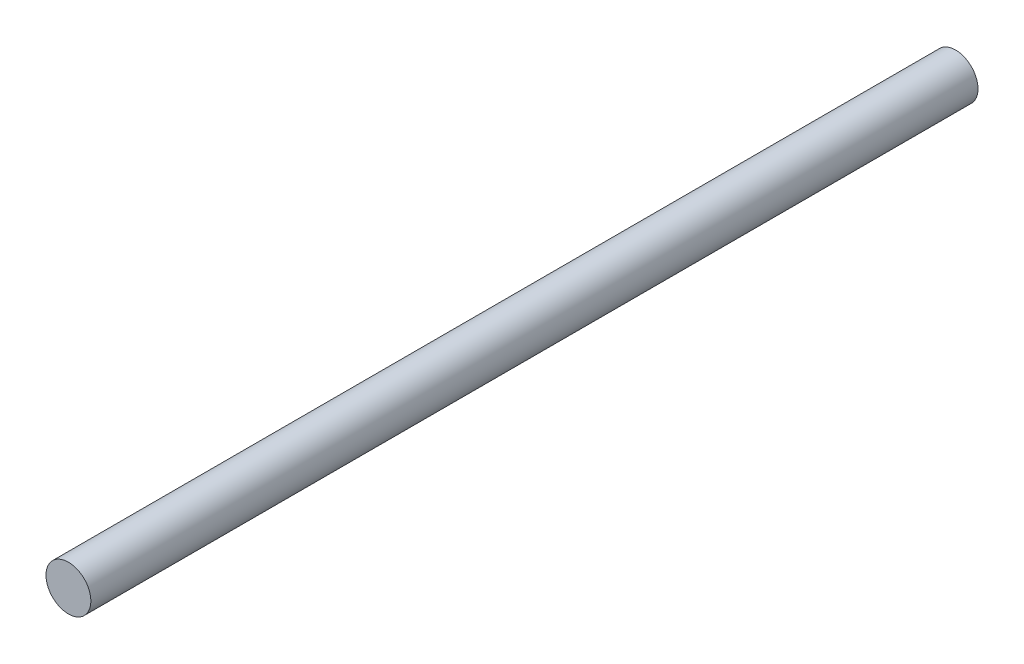
ISO-10303-21;
HEADER;
FILE_DESCRIPTION(('STEP AP214'),'2;1');
FILE_NAME('part.step','',(''),(''),'','','');
FILE_SCHEMA(('AUTOMOTIVE_DESIGN { 1 0 10303 214 1 1 1 1 }'));
ENDSEC;
DATA;
#1=APPLICATION_CONTEXT('core data for automotive mechanical design processes');
#2=APPLICATION_PROTOCOL_DEFINITION('international standard','automotive_design',2000,#1);
#3=PRODUCT_CONTEXT('',#1,'mechanical');
#4=PRODUCT('Part','Part','',(#3));
#5=PRODUCT_RELATED_PRODUCT_CATEGORY('part','',(#4));
#6=PRODUCT_DEFINITION_FORMATION('','',#4);
#7=PRODUCT_DEFINITION_CONTEXT('part definition',#1,'design');
#8=PRODUCT_DEFINITION('design','',#6,#7);
#9=PRODUCT_DEFINITION_SHAPE('','',#8);
#10=(LENGTH_UNIT() NAMED_UNIT(*) SI_UNIT(.MILLI.,.METRE.));
#11=(NAMED_UNIT(*) PLANE_ANGLE_UNIT() SI_UNIT($,.RADIAN.));
#12=(NAMED_UNIT(*) SI_UNIT($,.STERADIAN.) SOLID_ANGLE_UNIT());
#13=UNCERTAINTY_MEASURE_WITH_UNIT(LENGTH_MEASURE(1.E-05),#10,'distance_accuracy_value','');
#14=(GEOMETRIC_REPRESENTATION_CONTEXT(3) GLOBAL_UNCERTAINTY_ASSIGNED_CONTEXT((#13)) GLOBAL_UNIT_ASSIGNED_CONTEXT((#10,
#11,#12)) REPRESENTATION_CONTEXT('',''));
#15=CARTESIAN_POINT('',(0.,0.,0.));
#16=DIRECTION('',(0.,0.,1.));
#17=DIRECTION('',(1.,0.,0.));
#18=AXIS2_PLACEMENT_3D('',#15,#16,#17);
#19=CARTESIAN_POINT('',(0.,0.,62.738));
#20=DIRECTION('',(0.,0.,-1.));
#21=DIRECTION('',(-1.,0.,0.));
#22=AXIS2_PLACEMENT_3D('',#19,#20,#21);
#23=CYLINDRICAL_SURFACE('',#22,1.5875);
#24=CARTESIAN_POINT('',(0.,0.,62.738));
#25=DIRECTION('',(0.,0.,1.));
#26=DIRECTION('',(1.,0.,0.));
#27=AXIS2_PLACEMENT_3D('',#24,#25,#26);
#28=CIRCLE('',#27,1.5875);
#29=CARTESIAN_POINT('',(1.5875,0.,62.738));
#30=VERTEX_POINT('',#29);
#31=EDGE_CURVE('E10',#30,#30,#28,.T.);
#32=ORIENTED_EDGE('',*,*,#31,.F.);
#33=EDGE_LOOP('',(#32));
#34=FACE_BOUND('',#33,.T.);
#35=CARTESIAN_POINT('',(0.,0.,0.));
#36=DIRECTION('',(0.,0.,1.));
#37=DIRECTION('',(1.,0.,0.));
#38=AXIS2_PLACEMENT_3D('',#35,#36,#37);
#39=CIRCLE('',#38,1.5875);
#40=CARTESIAN_POINT('',(1.5875,0.,0.));
#41=VERTEX_POINT('',#40);
#42=EDGE_CURVE('E33',#41,#41,#39,.T.);
#43=ORIENTED_EDGE('',*,*,#42,.T.);
#44=EDGE_LOOP('',(#43));
#45=FACE_BOUND('',#44,.T.);
#46=ADVANCED_FACE('F30',(#34,#45),#23,.T.);
#47=CARTESIAN_POINT('',(0.,0.,62.738));
#48=DIRECTION('',(0.,0.,1.));
#49=DIRECTION('',(1.,0.,0.));
#50=AXIS2_PLACEMENT_3D('',#47,#48,#49);
#51=PLANE('',#50);
#52=ORIENTED_EDGE('',*,*,#31,.T.);
#53=EDGE_LOOP('',(#52));
#54=FACE_BOUND('',#53,.T.);
#55=ADVANCED_FACE('F45',(#54),#51,.T.);
#56=CARTESIAN_POINT('',(0.,0.,0.));
#57=DIRECTION('',(0.,0.,1.));
#58=DIRECTION('',(1.,0.,0.));
#59=AXIS2_PLACEMENT_3D('',#56,#57,#58);
#60=PLANE('',#59);
#61=ORIENTED_EDGE('',*,*,#42,.F.);
#62=EDGE_LOOP('',(#61));
#63=FACE_BOUND('',#62,.T.);
#64=ADVANCED_FACE('F43',(#63),#60,.F.);
#65=CLOSED_SHELL('',(#46,#55,#64));
#66=MANIFOLD_SOLID_BREP('B2',#65);
#67=ADVANCED_BREP_SHAPE_REPRESENTATION('',(#18,#66),#14);
#68=SHAPE_DEFINITION_REPRESENTATION(#9,#67);
ENDSEC;
END-ISO-10303-21;
